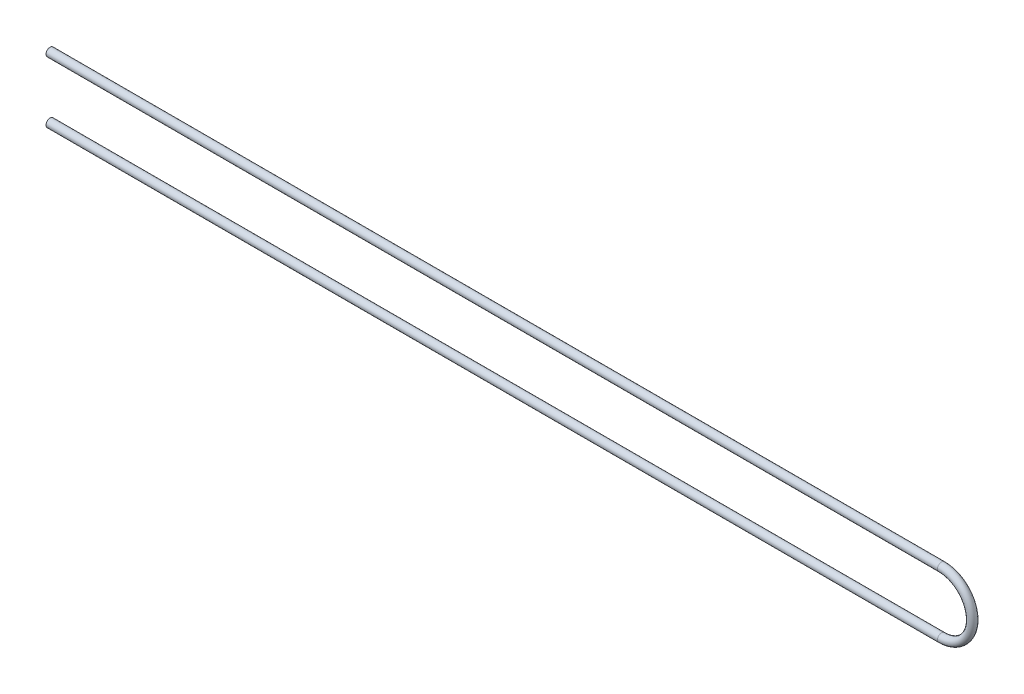
ISO-10303-21;
HEADER;
FILE_DESCRIPTION(('STEP AP214'),'2;1');
FILE_NAME('part.step','',(''),(''),'','','');
FILE_SCHEMA(('AUTOMOTIVE_DESIGN { 1 0 10303 214 1 1 1 1 }'));
ENDSEC;
DATA;
#1=APPLICATION_CONTEXT('core data for automotive mechanical design processes');
#2=APPLICATION_PROTOCOL_DEFINITION('international standard','automotive_design',2000,#1);
#3=PRODUCT_CONTEXT('',#1,'mechanical');
#4=PRODUCT('Part','Part','',(#3));
#5=PRODUCT_RELATED_PRODUCT_CATEGORY('part','',(#4));
#6=PRODUCT_DEFINITION_FORMATION('','',#4);
#7=PRODUCT_DEFINITION_CONTEXT('part definition',#1,'design');
#8=PRODUCT_DEFINITION('design','',#6,#7);
#9=PRODUCT_DEFINITION_SHAPE('','',#8);
#10=(LENGTH_UNIT() NAMED_UNIT(*) SI_UNIT(.MILLI.,.METRE.));
#11=(NAMED_UNIT(*) PLANE_ANGLE_UNIT() SI_UNIT($,.RADIAN.));
#12=(NAMED_UNIT(*) SI_UNIT($,.STERADIAN.) SOLID_ANGLE_UNIT());
#13=UNCERTAINTY_MEASURE_WITH_UNIT(LENGTH_MEASURE(1.E-05),#10,'distance_accuracy_value','');
#14=(GEOMETRIC_REPRESENTATION_CONTEXT(3) GLOBAL_UNCERTAINTY_ASSIGNED_CONTEXT((#13)) GLOBAL_UNIT_ASSIGNED_CONTEXT((#10,
#11,#12)) REPRESENTATION_CONTEXT('',''));
#15=CARTESIAN_POINT('',(0.,0.,0.));
#16=DIRECTION('',(0.,0.,1.));
#17=DIRECTION('',(1.,0.,0.));
#18=AXIS2_PLACEMENT_3D('',#15,#16,#17);
#19=CARTESIAN_POINT('',(0.,0.,0.));
#20=DIRECTION('',(-1.,0.,0.));
#21=DIRECTION('',(0.,-1.,0.));
#22=AXIS2_PLACEMENT_3D('',#19,#20,#21);
#23=PLANE('',#22);
#24=CARTESIAN_POINT('',(0.,0.,0.));
#25=DIRECTION('',(-1.,0.,0.));
#26=DIRECTION('',(0.,-1.,0.));
#27=AXIS2_PLACEMENT_3D('',#24,#25,#26);
#28=CIRCLE('',#27,10.15);
#29=CARTESIAN_POINT('',(0.,-10.15,0.));
#30=VERTEX_POINT('',#29);
#31=EDGE_CURVE('E72',#30,#30,#28,.T.);
#32=ORIENTED_EDGE('',*,*,#31,.F.);
#33=EDGE_LOOP('',(#32));
#34=FACE_BOUND('',#33,.T.);
#35=CARTESIAN_POINT('',(0.,0.,0.));
#36=DIRECTION('',(-1.,0.,0.));
#37=DIRECTION('',(0.,-1.,0.));
#38=AXIS2_PLACEMENT_3D('',#35,#36,#37);
#39=CIRCLE('',#38,10.65);
#40=CARTESIAN_POINT('',(0.,-10.65,0.));
#41=VERTEX_POINT('',#40);
#42=EDGE_CURVE('E63',#41,#41,#39,.T.);
#43=ORIENTED_EDGE('',*,*,#42,.T.);
#44=EDGE_LOOP('',(#43));
#45=FACE_BOUND('',#44,.T.);
#46=ADVANCED_FACE('F49',(#34,#45),#23,.T.);
#47=CARTESIAN_POINT('',(0.,-160.,0.));
#48=DIRECTION('',(1.,0.,0.));
#49=DIRECTION('',(0.,1.,0.));
#50=AXIS2_PLACEMENT_3D('',#47,#48,#49);
#51=PLANE('',#50);
#52=CARTESIAN_POINT('',(0.,-160.,0.));
#53=DIRECTION('',(1.,0.,0.));
#54=DIRECTION('',(0.,1.,0.));
#55=AXIS2_PLACEMENT_3D('',#52,#53,#54);
#56=CIRCLE('',#55,10.15);
#57=CARTESIAN_POINT('',(0.,-149.85,0.));
#58=VERTEX_POINT('',#57);
#59=EDGE_CURVE('E68',#58,#58,#56,.T.);
#60=ORIENTED_EDGE('',*,*,#59,.T.);
#61=EDGE_LOOP('',(#60));
#62=FACE_BOUND('',#61,.T.);
#63=CARTESIAN_POINT('',(0.,-160.,0.));
#64=DIRECTION('',(1.,0.,0.));
#65=DIRECTION('',(0.,1.,0.));
#66=AXIS2_PLACEMENT_3D('',#63,#64,#65);
#67=CIRCLE('',#66,10.65);
#68=CARTESIAN_POINT('',(0.,-149.35,0.));
#69=VERTEX_POINT('',#68);
#70=EDGE_CURVE('E11',#69,#69,#67,.T.);
#71=ORIENTED_EDGE('',*,*,#70,.F.);
#72=EDGE_LOOP('',(#71));
#73=FACE_BOUND('',#72,.T.);
#74=ADVANCED_FACE('F92',(#62,#73),#51,.F.);
#75=CARTESIAN_POINT('',(0.,0.,0.));
#76=DIRECTION('',(1.,0.,0.));
#77=DIRECTION('',(0.,0.,-1.));
#78=AXIS2_PLACEMENT_3D('',#75,#76,#77);
#79=CYLINDRICAL_SURFACE('',#78,10.65);
#80=CARTESIAN_POINT('',(2325.,0.,0.));
#81=DIRECTION('',(-1.,0.,0.));
#82=DIRECTION('',(0.,-1.,0.));
#83=AXIS2_PLACEMENT_3D('',#80,#81,#82);
#84=CIRCLE('',#83,10.65);
#85=CARTESIAN_POINT('',(2325.,10.65,0.));
#86=VERTEX_POINT('',#85);
#87=EDGE_CURVE('E59',#86,#86,#84,.T.);
#88=ORIENTED_EDGE('',*,*,#87,.T.);
#89=EDGE_LOOP('',(#88));
#90=FACE_BOUND('',#89,.T.);
#91=ORIENTED_EDGE('',*,*,#42,.F.);
#92=EDGE_LOOP('',(#91));
#93=FACE_BOUND('',#92,.T.);
#94=ADVANCED_FACE('F96',(#90,#93),#79,.T.);
#95=CARTESIAN_POINT('',(2325.,-80.,0.));
#96=DIRECTION('',(0.,0.,-1.));
#97=DIRECTION('',(-1.,0.,0.));
#98=AXIS2_PLACEMENT_3D('',#95,#96,#97);
#99=TOROIDAL_SURFACE('',#98,80.,10.65);
#100=CARTESIAN_POINT('',(2325.,-160.,0.));
#101=DIRECTION('',(1.,0.,0.));
#102=DIRECTION('',(0.,1.,0.));
#103=AXIS2_PLACEMENT_3D('',#100,#101,#102);
#104=CIRCLE('',#103,10.65);
#105=CARTESIAN_POINT('',(2325.,-170.65,0.));
#106=VERTEX_POINT('',#105);
#107=EDGE_CURVE('E55',#106,#106,#104,.T.);
#108=CARTESIAN_POINT('',(2325.,-80.,0.));
#109=DIRECTION('',(0.,0.,-1.));
#110=DIRECTION('',(-1.,0.,0.));
#111=AXIS2_PLACEMENT_3D('',#108,#109,#110);
#112=CIRCLE('',#111,90.65);
#113=EDGE_CURVE('',#86,#106,#112,.T.);
#114=ORIENTED_EDGE('',*,*,#87,.F.);
#115=ORIENTED_EDGE('',*,*,#107,.T.);
#116=ORIENTED_EDGE('',*,*,#113,.T.);
#117=ORIENTED_EDGE('',*,*,#113,.F.);
#118=EDGE_LOOP('',(#114,#116,#115,#117));
#119=FACE_BOUND('',#118,.T.);
#120=ADVANCED_FACE('F98',(#119),#99,.T.);
#121=CARTESIAN_POINT('',(2325.,-160.,0.));
#122=DIRECTION('',(-1.,0.,0.));
#123=DIRECTION('',(0.,-1.,0.));
#124=AXIS2_PLACEMENT_3D('',#121,#122,#123);
#125=CYLINDRICAL_SURFACE('',#124,10.65);
#126=ORIENTED_EDGE('',*,*,#70,.T.);
#127=EDGE_LOOP('',(#126));
#128=FACE_BOUND('',#127,.T.);
#129=ORIENTED_EDGE('',*,*,#107,.F.);
#130=EDGE_LOOP('',(#129));
#131=FACE_BOUND('',#130,.T.);
#132=ADVANCED_FACE('F86',(#128,#131),#125,.T.);
#133=CARTESIAN_POINT('',(0.,0.,0.));
#134=DIRECTION('',(1.,0.,0.));
#135=DIRECTION('',(0.,0.,-1.));
#136=AXIS2_PLACEMENT_3D('',#133,#134,#135);
#137=CYLINDRICAL_SURFACE('',#136,10.15);
#138=CARTESIAN_POINT('',(2325.,0.,0.));
#139=DIRECTION('',(1.,0.,0.));
#140=DIRECTION('',(0.,0.,-1.));
#141=AXIS2_PLACEMENT_3D('',#138,#139,#140);
#142=CIRCLE('',#141,10.15);
#143=CARTESIAN_POINT('',(2325.,10.15,0.));
#144=VERTEX_POINT('',#143);
#145=EDGE_CURVE('E75',#144,#144,#142,.F.);
#146=ORIENTED_EDGE('',*,*,#145,.F.);
#147=EDGE_LOOP('',(#146));
#148=FACE_BOUND('',#147,.T.);
#149=ORIENTED_EDGE('',*,*,#31,.T.);
#150=EDGE_LOOP('',(#149));
#151=FACE_BOUND('',#150,.T.);
#152=ADVANCED_FACE('F83',(#148,#151),#137,.F.);
#153=CARTESIAN_POINT('',(2325.,-80.,0.));
#154=DIRECTION('',(0.,0.,-1.));
#155=DIRECTION('',(-1.,0.,0.));
#156=AXIS2_PLACEMENT_3D('',#153,#154,#155);
#157=TOROIDAL_SURFACE('',#156,80.,10.15);
#158=CARTESIAN_POINT('',(2325.,-160.,0.));
#159=DIRECTION('',(1.,0.,0.));
#160=DIRECTION('',(0.,1.,0.));
#161=AXIS2_PLACEMENT_3D('',#158,#159,#160);
#162=CIRCLE('',#161,10.15);
#163=CARTESIAN_POINT('',(2325.,-170.15,0.));
#164=VERTEX_POINT('',#163);
#165=EDGE_CURVE('E71',#164,#164,#162,.T.);
#166=CARTESIAN_POINT('',(2325.,-80.,0.));
#167=DIRECTION('',(0.,0.,-1.));
#168=DIRECTION('',(-1.,0.,0.));
#169=AXIS2_PLACEMENT_3D('',#166,#167,#168);
#170=CIRCLE('',#169,90.15);
#171=EDGE_CURVE('',#144,#164,#170,.T.);
#172=ORIENTED_EDGE('',*,*,#145,.T.);
#173=ORIENTED_EDGE('',*,*,#165,.F.);
#174=ORIENTED_EDGE('',*,*,#171,.T.);
#175=ORIENTED_EDGE('',*,*,#171,.F.);
#176=EDGE_LOOP('',(#172,#174,#173,#175));
#177=FACE_BOUND('',#176,.T.);
#178=ADVANCED_FACE('F81',(#177),#157,.F.);
#179=CARTESIAN_POINT('',(2325.,-160.,0.));
#180=DIRECTION('',(-1.,0.,0.));
#181=DIRECTION('',(0.,-1.,0.));
#182=AXIS2_PLACEMENT_3D('',#179,#180,#181);
#183=CYLINDRICAL_SURFACE('',#182,10.15);
#184=ORIENTED_EDGE('',*,*,#59,.F.);
#185=EDGE_LOOP('',(#184));
#186=FACE_BOUND('',#185,.T.);
#187=ORIENTED_EDGE('',*,*,#165,.T.);
#188=EDGE_LOOP('',(#187));
#189=FACE_BOUND('',#188,.T.);
#190=ADVANCED_FACE('F93',(#186,#189),#183,.F.);
#191=CLOSED_SHELL('',(#46,#74,#94,#120,#132,#152,#178,#190));
#192=MANIFOLD_SOLID_BREP('B2',#191);
#193=ADVANCED_BREP_SHAPE_REPRESENTATION('',(#18,#192),#14);
#194=SHAPE_DEFINITION_REPRESENTATION(#9,#193);
ENDSEC;
END-ISO-10303-21;
